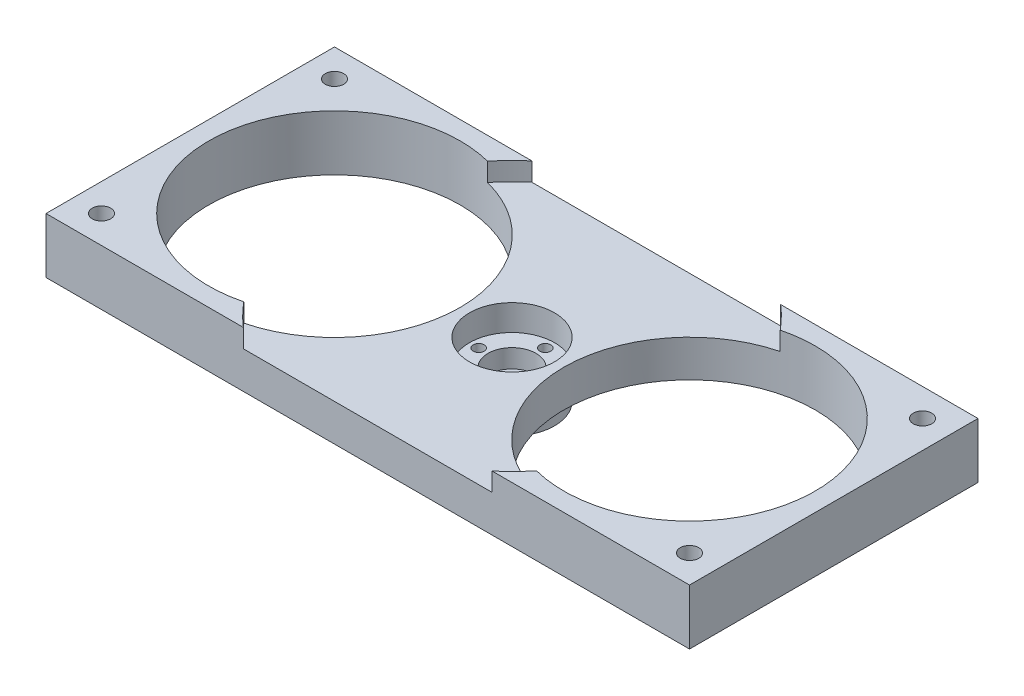
ISO-10303-21;
HEADER;
FILE_DESCRIPTION(('STEP AP214'),'2;1');
FILE_NAME('part.step','',(''),(''),'','','');
FILE_SCHEMA(('AUTOMOTIVE_DESIGN { 1 0 10303 214 1 1 1 1 }'));
ENDSEC;
DATA;
#1=APPLICATION_CONTEXT('core data for automotive mechanical design processes');
#2=APPLICATION_PROTOCOL_DEFINITION('international standard','automotive_design',2000,#1);
#3=PRODUCT_CONTEXT('',#1,'mechanical');
#4=PRODUCT('Part','Part','',(#3));
#5=PRODUCT_RELATED_PRODUCT_CATEGORY('part','',(#4));
#6=PRODUCT_DEFINITION_FORMATION('','',#4);
#7=PRODUCT_DEFINITION_CONTEXT('part definition',#1,'design');
#8=PRODUCT_DEFINITION('design','',#6,#7);
#9=PRODUCT_DEFINITION_SHAPE('','',#8);
#10=(LENGTH_UNIT() NAMED_UNIT(*) SI_UNIT(.MILLI.,.METRE.));
#11=(NAMED_UNIT(*) PLANE_ANGLE_UNIT() SI_UNIT($,.RADIAN.));
#12=(NAMED_UNIT(*) SI_UNIT($,.STERADIAN.) SOLID_ANGLE_UNIT());
#13=UNCERTAINTY_MEASURE_WITH_UNIT(LENGTH_MEASURE(1.E-05),#10,'distance_accuracy_value','');
#14=(GEOMETRIC_REPRESENTATION_CONTEXT(3) GLOBAL_UNCERTAINTY_ASSIGNED_CONTEXT((#13)) GLOBAL_UNIT_ASSIGNED_CONTEXT((#10,
#11,#12)) REPRESENTATION_CONTEXT('',''));
#15=CARTESIAN_POINT('',(0.,0.,0.));
#16=DIRECTION('',(0.,0.,1.));
#17=DIRECTION('',(1.,0.,0.));
#18=AXIS2_PLACEMENT_3D('',#15,#16,#17);
#19=CARTESIAN_POINT('',(0.,0.,0.));
#20=DIRECTION('',(0.,1.,0.));
#21=DIRECTION('',(0.,0.,1.));
#22=AXIS2_PLACEMENT_3D('',#19,#20,#21);
#23=PLANE('',#22);
#24=CARTESIAN_POINT('',(0.,0.,-9.));
#25=DIRECTION('',(0.,1.,0.));
#26=DIRECTION('',(0.,0.,1.));
#27=AXIS2_PLACEMENT_3D('',#24,#25,#26);
#28=CIRCLE('',#27,1.5);
#29=CARTESIAN_POINT('',(0.,0.,-7.5));
#30=VERTEX_POINT('',#29);
#31=EDGE_CURVE('E250',#30,#30,#28,.T.);
#32=ORIENTED_EDGE('',*,*,#31,.T.);
#33=EDGE_LOOP('',(#32));
#34=FACE_BOUND('',#33,.T.);
#35=CARTESIAN_POINT('',(-9.,0.,0.));
#36=DIRECTION('',(0.,1.,0.));
#37=DIRECTION('',(0.,0.,1.));
#38=AXIS2_PLACEMENT_3D('',#35,#36,#37);
#39=CIRCLE('',#38,1.5);
#40=CARTESIAN_POINT('',(-9.,0.,1.5));
#41=VERTEX_POINT('',#40);
#42=EDGE_CURVE('E254',#41,#41,#39,.T.);
#43=ORIENTED_EDGE('',*,*,#42,.T.);
#44=EDGE_LOOP('',(#43));
#45=FACE_BOUND('',#44,.T.);
#46=CARTESIAN_POINT('',(0.,0.,9.));
#47=DIRECTION('',(0.,1.,0.));
#48=DIRECTION('',(0.,0.,1.));
#49=AXIS2_PLACEMENT_3D('',#46,#47,#48);
#50=CIRCLE('',#49,1.5);
#51=CARTESIAN_POINT('',(0.,0.,10.5));
#52=VERTEX_POINT('',#51);
#53=EDGE_CURVE('E260',#52,#52,#50,.T.);
#54=ORIENTED_EDGE('',*,*,#53,.T.);
#55=EDGE_LOOP('',(#54));
#56=FACE_BOUND('',#55,.T.);
#57=CARTESIAN_POINT('',(9.,0.,0.));
#58=DIRECTION('',(0.,1.,0.));
#59=DIRECTION('',(0.,0.,1.));
#60=AXIS2_PLACEMENT_3D('',#57,#58,#59);
#61=CIRCLE('',#60,1.5);
#62=CARTESIAN_POINT('',(9.,0.,1.5));
#63=VERTEX_POINT('',#62);
#64=EDGE_CURVE('E271',#63,#63,#61,.T.);
#65=ORIENTED_EDGE('',*,*,#64,.T.);
#66=EDGE_LOOP('',(#65));
#67=FACE_BOUND('',#66,.T.);
#68=CARTESIAN_POINT('',(0.,0.,0.));
#69=DIRECTION('',(0.,1.,0.));
#70=DIRECTION('',(0.,0.,1.));
#71=AXIS2_PLACEMENT_3D('',#68,#69,#70);
#72=CIRCLE('',#71,2.5);
#73=CARTESIAN_POINT('',(0.,0.,2.5));
#74=VERTEX_POINT('',#73);
#75=EDGE_CURVE('E74',#74,#74,#72,.T.);
#76=ORIENTED_EDGE('',*,*,#75,.T.);
#77=EDGE_LOOP('',(#76));
#78=FACE_BOUND('',#77,.T.);
#79=CARTESIAN_POINT('',(0.,0.,0.));
#80=DIRECTION('',(0.,-1.,0.));
#81=DIRECTION('',(0.,0.,-1.));
#82=AXIS2_PLACEMENT_3D('',#79,#80,#81);
#83=CIRCLE('',#82,11.5);
#84=CARTESIAN_POINT('',(0.,0.,-11.5));
#85=VERTEX_POINT('',#84);
#86=EDGE_CURVE('E402',#85,#85,#83,.T.);
#87=ORIENTED_EDGE('',*,*,#86,.T.);
#88=EDGE_LOOP('',(#87));
#89=FACE_BOUND('',#88,.T.);
#90=ADVANCED_FACE('F65',(#34,#45,#56,#67,#78,#89),#23,.F.);
#91=CARTESIAN_POINT('',(0.,15.,39.));
#92=DIRECTION('',(0.,0.,1.));
#93=DIRECTION('',(1.,0.,0.));
#94=AXIS2_PLACEMENT_3D('',#91,#92,#93);
#95=PLANE('',#94);
#96=DIRECTION('',(0.,-1.,0.));
#97=VECTOR('',#96,1.);
#98=CARTESIAN_POINT('',(-87.,20.,39.));
#99=LINE('',#98,#97);
#100=CARTESIAN_POINT('',(-87.,20.,39.));
#101=VERTEX_POINT('',#100);
#102=CARTESIAN_POINT('',(-87.,5.,39.));
#103=VERTEX_POINT('',#102);
#104=EDGE_CURVE('E171',#101,#103,#99,.T.);
#105=ORIENTED_EDGE('',*,*,#104,.T.);
#106=DIRECTION('',(-1.,0.,0.));
#107=VECTOR('',#106,1.);
#108=CARTESIAN_POINT('',(87.,5.,39.));
#109=LINE('',#108,#107);
#110=CARTESIAN_POINT('',(87.,5.,39.));
#111=VERTEX_POINT('',#110);
#112=EDGE_CURVE('E156',#111,#103,#109,.T.);
#113=ORIENTED_EDGE('',*,*,#112,.F.);
#114=DIRECTION('',(0.,-1.,0.));
#115=VECTOR('',#114,1.);
#116=CARTESIAN_POINT('',(87.,20.,39.));
#117=LINE('',#116,#115);
#118=CARTESIAN_POINT('',(87.,20.,39.));
#119=VERTEX_POINT('',#118);
#120=EDGE_CURVE('E167',#119,#111,#117,.T.);
#121=ORIENTED_EDGE('',*,*,#120,.F.);
#122=DIRECTION('',(-1.,0.,0.));
#123=VECTOR('',#122,1.);
#124=CARTESIAN_POINT('',(0.,20.,39.));
#125=LINE('',#124,#123);
#126=CARTESIAN_POINT('',(33.6340601176843,20.,39.));
#127=VERTEX_POINT('',#126);
#128=EDGE_CURVE('E432',#119,#127,#125,.T.);
#129=ORIENTED_EDGE('',*,*,#128,.T.);
#130=DIRECTION('',(0.,-1.,0.));
#131=VECTOR('',#130,1.);
#132=CARTESIAN_POINT('',(33.6340601176843,20.,39.));
#133=LINE('',#132,#131);
#134=CARTESIAN_POINT('',(33.6340601176843,15.,39.));
#135=VERTEX_POINT('',#134);
#136=EDGE_CURVE('E178',#127,#135,#133,.T.);
#137=ORIENTED_EDGE('',*,*,#136,.T.);
#138=DIRECTION('',(-1.,0.,0.));
#139=VECTOR('',#138,1.);
#140=CARTESIAN_POINT('',(0.,15.,39.));
#141=LINE('',#140,#139);
#142=CARTESIAN_POINT('',(-33.6340601176843,15.,39.));
#143=VERTEX_POINT('',#142);
#144=EDGE_CURVE('E224',#135,#143,#141,.T.);
#145=ORIENTED_EDGE('',*,*,#144,.T.);
#146=DIRECTION('',(0.,-1.,0.));
#147=VECTOR('',#146,1.);
#148=CARTESIAN_POINT('',(-33.6340601176843,20.,39.));
#149=LINE('',#148,#147);
#150=CARTESIAN_POINT('',(-33.6340601176843,20.,39.));
#151=VERTEX_POINT('',#150);
#152=EDGE_CURVE('E90',#151,#143,#149,.T.);
#153=ORIENTED_EDGE('',*,*,#152,.F.);
#154=DIRECTION('',(-1.,0.,0.));
#155=VECTOR('',#154,1.);
#156=CARTESIAN_POINT('',(0.,20.,39.));
#157=LINE('',#156,#155);
#158=EDGE_CURVE('E201',#151,#101,#157,.T.);
#159=ORIENTED_EDGE('',*,*,#158,.T.);
#160=EDGE_LOOP('',(#105,#113,#121,#129,#137,#145,#153,#159));
#161=FACE_BOUND('',#160,.T.);
#162=ADVANCED_FACE('F165',(#161),#95,.T.);
#163=CARTESIAN_POINT('',(48.,15.,0.));
#164=DIRECTION('',(0.,-1.,0.));
#165=DIRECTION('',(0.,0.,-1.));
#166=AXIS2_PLACEMENT_3D('',#163,#164,#165);
#167=CYLINDRICAL_SURFACE('',#166,34.);
#168=CARTESIAN_POINT('',(48.,15.,0.));
#169=DIRECTION('',(0.,1.,0.));
#170=DIRECTION('',(0.,0.,1.));
#171=AXIS2_PLACEMENT_3D('',#168,#169,#170);
#172=CIRCLE('',#171,34.);
#173=CARTESIAN_POINT('',(39.5859375,15.,-32.9424278438322));
#174=VERTEX_POINT('',#173);
#175=CARTESIAN_POINT('',(39.5859375,15.,32.9424278438322));
#176=VERTEX_POINT('',#175);
#177=EDGE_CURVE('E230',#174,#176,#172,.T.);
#178=ORIENTED_EDGE('',*,*,#177,.T.);
#179=DIRECTION('',(0.,-1.,0.));
#180=VECTOR('',#179,1.);
#181=CARTESIAN_POINT('',(39.5859375,20.,32.9424278438322));
#182=LINE('',#181,#180);
#183=CARTESIAN_POINT('',(39.5859375,20.,32.9424278438322));
#184=VERTEX_POINT('',#183);
#185=EDGE_CURVE('E443',#184,#176,#182,.T.);
#186=ORIENTED_EDGE('',*,*,#185,.F.);
#187=CARTESIAN_POINT('',(48.,20.,0.));
#188=DIRECTION('',(0.,1.,0.));
#189=DIRECTION('',(0.,0.,1.));
#190=AXIS2_PLACEMENT_3D('',#187,#188,#189);
#191=CIRCLE('',#190,34.);
#192=CARTESIAN_POINT('',(39.5859375,20.,-32.9424278438322));
#193=VERTEX_POINT('',#192);
#194=EDGE_CURVE('E440',#184,#193,#191,.T.);
#195=ORIENTED_EDGE('',*,*,#194,.T.);
#196=DIRECTION('',(0.,-1.,0.));
#197=VECTOR('',#196,1.);
#198=CARTESIAN_POINT('',(39.5859375,20.,-32.9424278438322));
#199=LINE('',#198,#197);
#200=EDGE_CURVE('E445',#193,#174,#199,.T.);
#201=ORIENTED_EDGE('',*,*,#200,.T.);
#202=EDGE_LOOP('',(#178,#186,#195,#201));
#203=FACE_BOUND('',#202,.T.);
#204=CARTESIAN_POINT('',(48.,5.,0.));
#205=DIRECTION('',(0.,-1.,0.));
#206=DIRECTION('',(0.,0.,-1.));
#207=AXIS2_PLACEMENT_3D('',#204,#205,#206);
#208=CIRCLE('',#207,34.);
#209=CARTESIAN_POINT('',(48.,5.,-34.));
#210=VERTEX_POINT('',#209);
#211=EDGE_CURVE('E420',#210,#210,#208,.T.);
#212=ORIENTED_EDGE('',*,*,#211,.T.);
#213=EDGE_LOOP('',(#212));
#214=FACE_BOUND('',#213,.T.);
#215=ADVANCED_FACE('F303',(#203,#214),#167,.F.);
#216=CARTESIAN_POINT('',(0.,15.,-39.));
#217=DIRECTION('',(0.,0.,1.));
#218=DIRECTION('',(1.,0.,0.));
#219=AXIS2_PLACEMENT_3D('',#216,#217,#218);
#220=PLANE('',#219);
#221=DIRECTION('',(1.,0.,0.));
#222=VECTOR('',#221,1.);
#223=CARTESIAN_POINT('',(-87.,5.,-39.));
#224=LINE('',#223,#222);
#225=CARTESIAN_POINT('',(-87.,5.,-39.));
#226=VERTEX_POINT('',#225);
#227=CARTESIAN_POINT('',(87.,5.,-39.));
#228=VERTEX_POINT('',#227);
#229=EDGE_CURVE('E82',#226,#228,#224,.T.);
#230=ORIENTED_EDGE('',*,*,#229,.F.);
#231=DIRECTION('',(0.,-1.,0.));
#232=VECTOR('',#231,1.);
#233=CARTESIAN_POINT('',(-87.,20.,-39.));
#234=LINE('',#233,#232);
#235=CARTESIAN_POINT('',(-87.,20.,-39.));
#236=VERTEX_POINT('',#235);
#237=EDGE_CURVE('E215',#236,#226,#234,.T.);
#238=ORIENTED_EDGE('',*,*,#237,.F.);
#239=DIRECTION('',(-1.,0.,0.));
#240=VECTOR('',#239,1.);
#241=CARTESIAN_POINT('',(0.,20.,-39.));
#242=LINE('',#241,#240);
#243=CARTESIAN_POINT('',(-33.6340601176843,20.,-39.));
#244=VERTEX_POINT('',#243);
#245=EDGE_CURVE('E196',#244,#236,#242,.T.);
#246=ORIENTED_EDGE('',*,*,#245,.F.);
#247=DIRECTION('',(0.,-1.,0.));
#248=VECTOR('',#247,1.);
#249=CARTESIAN_POINT('',(-33.6340601176843,20.,-39.));
#250=LINE('',#249,#248);
#251=CARTESIAN_POINT('',(-33.6340601176843,15.,-39.));
#252=VERTEX_POINT('',#251);
#253=EDGE_CURVE('E218',#244,#252,#250,.T.);
#254=ORIENTED_EDGE('',*,*,#253,.T.);
#255=DIRECTION('',(-1.,0.,0.));
#256=VECTOR('',#255,1.);
#257=CARTESIAN_POINT('',(0.,15.,-39.));
#258=LINE('',#257,#256);
#259=CARTESIAN_POINT('',(33.6340601176843,15.,-39.));
#260=VERTEX_POINT('',#259);
#261=EDGE_CURVE('E236',#260,#252,#258,.T.);
#262=ORIENTED_EDGE('',*,*,#261,.F.);
#263=DIRECTION('',(0.,-1.,0.));
#264=VECTOR('',#263,1.);
#265=CARTESIAN_POINT('',(33.6340601176843,20.,-39.));
#266=LINE('',#265,#264);
#267=CARTESIAN_POINT('',(33.6340601176843,20.,-39.));
#268=VERTEX_POINT('',#267);
#269=EDGE_CURVE('E184',#268,#260,#266,.T.);
#270=ORIENTED_EDGE('',*,*,#269,.F.);
#271=DIRECTION('',(-1.,0.,0.));
#272=VECTOR('',#271,1.);
#273=CARTESIAN_POINT('',(0.,20.,-39.));
#274=LINE('',#273,#272);
#275=CARTESIAN_POINT('',(87.,20.,-39.));
#276=VERTEX_POINT('',#275);
#277=EDGE_CURVE('E435',#276,#268,#274,.T.);
#278=ORIENTED_EDGE('',*,*,#277,.F.);
#279=DIRECTION('',(0.,-1.,0.));
#280=VECTOR('',#279,1.);
#281=CARTESIAN_POINT('',(87.,20.,-39.));
#282=LINE('',#281,#280);
#283=EDGE_CURVE('E179',#276,#228,#282,.T.);
#284=ORIENTED_EDGE('',*,*,#283,.T.);
#285=EDGE_LOOP('',(#230,#238,#246,#254,#262,#270,#278,#284));
#286=FACE_BOUND('',#285,.T.);
#287=ADVANCED_FACE('F337',(#286),#220,.F.);
#288=CARTESIAN_POINT('',(-48.,15.,0.));
#289=DIRECTION('',(0.,-1.,0.));
#290=DIRECTION('',(0.,0.,-1.));
#291=AXIS2_PLACEMENT_3D('',#288,#289,#290);
#292=CYLINDRICAL_SURFACE('',#291,34.);
#293=CARTESIAN_POINT('',(-48.,15.,0.));
#294=DIRECTION('',(0.,1.,0.));
#295=DIRECTION('',(0.,0.,1.));
#296=AXIS2_PLACEMENT_3D('',#293,#294,#295);
#297=CIRCLE('',#296,34.);
#298=CARTESIAN_POINT('',(-39.5859375,15.,32.9424278438322));
#299=VERTEX_POINT('',#298);
#300=CARTESIAN_POINT('',(-39.5859375,15.,-32.9424278438322));
#301=VERTEX_POINT('',#300);
#302=EDGE_CURVE('E242',#299,#301,#297,.T.);
#303=ORIENTED_EDGE('',*,*,#302,.T.);
#304=DIRECTION('',(0.,-1.,0.));
#305=VECTOR('',#304,1.);
#306=CARTESIAN_POINT('',(-39.5859375,20.,-32.9424278438322));
#307=LINE('',#306,#305);
#308=CARTESIAN_POINT('',(-39.5859375,20.,-32.9424278438322));
#309=VERTEX_POINT('',#308);
#310=EDGE_CURVE('E208',#309,#301,#307,.T.);
#311=ORIENTED_EDGE('',*,*,#310,.F.);
#312=CARTESIAN_POINT('',(-48.,20.,0.));
#313=DIRECTION('',(0.,1.,0.));
#314=DIRECTION('',(0.,0.,1.));
#315=AXIS2_PLACEMENT_3D('',#312,#313,#314);
#316=CIRCLE('',#315,34.);
#317=CARTESIAN_POINT('',(-39.5859375,20.,32.9424278438322));
#318=VERTEX_POINT('',#317);
#319=EDGE_CURVE('E205',#309,#318,#316,.T.);
#320=ORIENTED_EDGE('',*,*,#319,.T.);
#321=DIRECTION('',(0.,-1.,0.));
#322=VECTOR('',#321,1.);
#323=CARTESIAN_POINT('',(-39.5859375,20.,32.9424278438322));
#324=LINE('',#323,#322);
#325=EDGE_CURVE('E210',#318,#299,#324,.T.);
#326=ORIENTED_EDGE('',*,*,#325,.T.);
#327=EDGE_LOOP('',(#303,#311,#320,#326));
#328=FACE_BOUND('',#327,.T.);
#329=CARTESIAN_POINT('',(-48.,5.,0.));
#330=DIRECTION('',(0.,-1.,0.));
#331=DIRECTION('',(0.,0.,-1.));
#332=AXIS2_PLACEMENT_3D('',#329,#330,#331);
#333=CIRCLE('',#332,34.);
#334=CARTESIAN_POINT('',(-48.,5.,-34.));
#335=VERTEX_POINT('',#334);
#336=EDGE_CURVE('E417',#335,#335,#333,.T.);
#337=ORIENTED_EDGE('',*,*,#336,.T.);
#338=EDGE_LOOP('',(#337));
#339=FACE_BOUND('',#338,.T.);
#340=ADVANCED_FACE('F341',(#328,#339),#292,.F.);
#341=CARTESIAN_POINT('',(-87.,20.,0.));
#342=DIRECTION('',(1.,0.,0.));
#343=DIRECTION('',(0.,0.,-1.));
#344=AXIS2_PLACEMENT_3D('',#341,#342,#343);
#345=PLANE('',#344);
#346=DIRECTION('',(0.,0.,-1.));
#347=VECTOR('',#346,1.);
#348=CARTESIAN_POINT('',(-87.,5.,39.));
#349=LINE('',#348,#347);
#350=EDGE_CURVE('E172',#103,#226,#349,.T.);
#351=ORIENTED_EDGE('',*,*,#350,.F.);
#352=ORIENTED_EDGE('',*,*,#104,.F.);
#353=DIRECTION('',(0.,0.,1.));
#354=VECTOR('',#353,1.);
#355=CARTESIAN_POINT('',(-87.,20.,0.));
#356=LINE('',#355,#354);
#357=EDGE_CURVE('E199',#236,#101,#356,.T.);
#358=ORIENTED_EDGE('',*,*,#357,.F.);
#359=ORIENTED_EDGE('',*,*,#237,.T.);
#360=EDGE_LOOP('',(#351,#352,#358,#359));
#361=FACE_BOUND('',#360,.T.);
#362=ADVANCED_FACE('F345',(#361),#345,.F.);
#363=CARTESIAN_POINT('',(-79.5,20.,31.5));
#364=DIRECTION('',(0.,-1.,0.));
#365=DIRECTION('',(0.,0.,-1.));
#366=AXIS2_PLACEMENT_3D('',#363,#364,#365);
#367=CYLINDRICAL_SURFACE('',#366,2.5);
#368=CARTESIAN_POINT('',(-79.5,20.,31.5));
#369=DIRECTION('',(0.,1.,0.));
#370=DIRECTION('',(0.,0.,1.));
#371=AXIS2_PLACEMENT_3D('',#368,#369,#370);
#372=CIRCLE('',#371,2.5);
#373=CARTESIAN_POINT('',(-79.5,20.,34.));
#374=VERTEX_POINT('',#373);
#375=EDGE_CURVE('E190',#374,#374,#372,.T.);
#376=ORIENTED_EDGE('',*,*,#375,.T.);
#377=EDGE_LOOP('',(#376));
#378=FACE_BOUND('',#377,.T.);
#379=CARTESIAN_POINT('',(-79.5,5.,31.5));
#380=DIRECTION('',(0.,-1.,0.));
#381=DIRECTION('',(0.,0.,-1.));
#382=AXIS2_PLACEMENT_3D('',#379,#380,#381);
#383=CIRCLE('',#382,2.5);
#384=CARTESIAN_POINT('',(-79.5,5.,29.));
#385=VERTEX_POINT('',#384);
#386=EDGE_CURVE('E414',#385,#385,#383,.T.);
#387=ORIENTED_EDGE('',*,*,#386,.T.);
#388=EDGE_LOOP('',(#387));
#389=FACE_BOUND('',#388,.T.);
#390=ADVANCED_FACE('F354',(#378,#389),#367,.F.);
#391=CARTESIAN_POINT('',(-79.5,20.,-31.5));
#392=DIRECTION('',(0.,-1.,0.));
#393=DIRECTION('',(0.,0.,-1.));
#394=AXIS2_PLACEMENT_3D('',#391,#392,#393);
#395=CYLINDRICAL_SURFACE('',#394,2.5);
#396=CARTESIAN_POINT('',(-79.5,20.,-31.5));
#397=DIRECTION('',(0.,1.,0.));
#398=DIRECTION('',(0.,0.,1.));
#399=AXIS2_PLACEMENT_3D('',#396,#397,#398);
#400=CIRCLE('',#399,2.5);
#401=CARTESIAN_POINT('',(-79.5,20.,-29.));
#402=VERTEX_POINT('',#401);
#403=EDGE_CURVE('E182',#402,#402,#400,.T.);
#404=ORIENTED_EDGE('',*,*,#403,.T.);
#405=EDGE_LOOP('',(#404));
#406=FACE_BOUND('',#405,.T.);
#407=CARTESIAN_POINT('',(-79.5,5.,-31.5));
#408=DIRECTION('',(0.,-1.,0.));
#409=DIRECTION('',(0.,0.,-1.));
#410=AXIS2_PLACEMENT_3D('',#407,#408,#409);
#411=CIRCLE('',#410,2.5);
#412=CARTESIAN_POINT('',(-79.5,5.,-34.));
#413=VERTEX_POINT('',#412);
#414=EDGE_CURVE('E411',#413,#413,#411,.T.);
#415=ORIENTED_EDGE('',*,*,#414,.T.);
#416=EDGE_LOOP('',(#415));
#417=FACE_BOUND('',#416,.T.);
#418=ADVANCED_FACE('F351',(#406,#417),#395,.F.);
#419=CARTESIAN_POINT('',(87.,20.,0.));
#420=DIRECTION('',(1.,0.,0.));
#421=DIRECTION('',(0.,0.,-1.));
#422=AXIS2_PLACEMENT_3D('',#419,#420,#421);
#423=PLANE('',#422);
#424=ORIENTED_EDGE('',*,*,#120,.T.);
#425=DIRECTION('',(0.,0.,1.));
#426=VECTOR('',#425,1.);
#427=CARTESIAN_POINT('',(87.,5.,-39.));
#428=LINE('',#427,#426);
#429=EDGE_CURVE('E153',#228,#111,#428,.T.);
#430=ORIENTED_EDGE('',*,*,#429,.F.);
#431=ORIENTED_EDGE('',*,*,#283,.F.);
#432=DIRECTION('',(0.,0.,1.));
#433=VECTOR('',#432,1.);
#434=CARTESIAN_POINT('',(87.,20.,0.));
#435=LINE('',#434,#433);
#436=EDGE_CURVE('E177',#276,#119,#435,.T.);
#437=ORIENTED_EDGE('',*,*,#436,.T.);
#438=EDGE_LOOP('',(#424,#430,#431,#437));
#439=FACE_BOUND('',#438,.T.);
#440=ADVANCED_FACE('F175',(#439),#423,.T.);
#441=CARTESIAN_POINT('',(79.5,20.,-31.5));
#442=DIRECTION('',(0.,-1.,0.));
#443=DIRECTION('',(0.,0.,-1.));
#444=AXIS2_PLACEMENT_3D('',#441,#442,#443);
#445=CYLINDRICAL_SURFACE('',#444,2.5);
#446=CARTESIAN_POINT('',(79.5,20.,-31.5));
#447=DIRECTION('',(0.,1.,0.));
#448=DIRECTION('',(0.,0.,1.));
#449=AXIS2_PLACEMENT_3D('',#446,#447,#448);
#450=CIRCLE('',#449,2.5);
#451=CARTESIAN_POINT('',(79.5,20.,-29.));
#452=VERTEX_POINT('',#451);
#453=EDGE_CURVE('E426',#452,#452,#450,.T.);
#454=ORIENTED_EDGE('',*,*,#453,.T.);
#455=EDGE_LOOP('',(#454));
#456=FACE_BOUND('',#455,.T.);
#457=CARTESIAN_POINT('',(79.5,5.,-31.5));
#458=DIRECTION('',(0.,-1.,0.));
#459=DIRECTION('',(0.,0.,-1.));
#460=AXIS2_PLACEMENT_3D('',#457,#458,#459);
#461=CIRCLE('',#460,2.5);
#462=CARTESIAN_POINT('',(79.5,5.,-34.));
#463=VERTEX_POINT('',#462);
#464=EDGE_CURVE('E408',#463,#463,#461,.T.);
#465=ORIENTED_EDGE('',*,*,#464,.T.);
#466=EDGE_LOOP('',(#465));
#467=FACE_BOUND('',#466,.T.);
#468=ADVANCED_FACE('F295',(#456,#467),#445,.F.);
#469=CARTESIAN_POINT('',(79.5,20.,31.5));
#470=DIRECTION('',(0.,-1.,0.));
#471=DIRECTION('',(0.,0.,-1.));
#472=AXIS2_PLACEMENT_3D('',#469,#470,#471);
#473=CYLINDRICAL_SURFACE('',#472,2.49999999999999);
#474=CARTESIAN_POINT('',(79.5,20.,31.5));
#475=DIRECTION('',(0.,1.,0.));
#476=DIRECTION('',(0.,0.,1.));
#477=AXIS2_PLACEMENT_3D('',#474,#475,#476);
#478=CIRCLE('',#477,2.49999999999999);
#479=CARTESIAN_POINT('',(79.5,20.,34.));
#480=VERTEX_POINT('',#479);
#481=EDGE_CURVE('E423',#480,#480,#478,.T.);
#482=ORIENTED_EDGE('',*,*,#481,.T.);
#483=EDGE_LOOP('',(#482));
#484=FACE_BOUND('',#483,.T.);
#485=CARTESIAN_POINT('',(79.5,5.,31.5));
#486=DIRECTION('',(0.,-1.,0.));
#487=DIRECTION('',(0.,0.,-1.));
#488=AXIS2_PLACEMENT_3D('',#485,#486,#487);
#489=CIRCLE('',#488,2.49999999999999);
#490=CARTESIAN_POINT('',(79.5,5.,29.));
#491=VERTEX_POINT('',#490);
#492=EDGE_CURVE('E69',#491,#491,#489,.T.);
#493=ORIENTED_EDGE('',*,*,#492,.T.);
#494=EDGE_LOOP('',(#493));
#495=FACE_BOUND('',#494,.T.);
#496=ADVANCED_FACE('F286',(#484,#495),#473,.F.);
#497=CARTESIAN_POINT('',(0.,3.,0.));
#498=DIRECTION('',(0.,-1.,0.));
#499=DIRECTION('',(0.,0.,-1.));
#500=AXIS2_PLACEMENT_3D('',#497,#498,#499);
#501=CYLINDRICAL_SURFACE('',#500,2.5);
#502=CARTESIAN_POINT('',(0.,3.,0.));
#503=DIRECTION('',(0.,1.,0.));
#504=DIRECTION('',(0.,0.,1.));
#505=AXIS2_PLACEMENT_3D('',#502,#503,#504);
#506=CIRCLE('',#505,2.5);
#507=CARTESIAN_POINT('',(0.,3.,2.5));
#508=VERTEX_POINT('',#507);
#509=EDGE_CURVE('E12',#508,#508,#506,.T.);
#510=ORIENTED_EDGE('',*,*,#509,.T.);
#511=EDGE_LOOP('',(#510));
#512=FACE_BOUND('',#511,.T.);
#513=ORIENTED_EDGE('',*,*,#75,.F.);
#514=EDGE_LOOP('',(#513));
#515=FACE_BOUND('',#514,.T.);
#516=ADVANCED_FACE('F67',(#512,#515),#501,.F.);
#517=CARTESIAN_POINT('',(0.,3.,0.));
#518=DIRECTION('',(0.,1.,0.));
#519=DIRECTION('',(0.,0.,1.));
#520=AXIS2_PLACEMENT_3D('',#517,#518,#519);
#521=PLANE('',#520);
#522=ORIENTED_EDGE('',*,*,#509,.F.);
#523=EDGE_LOOP('',(#522));
#524=FACE_BOUND('',#523,.T.);
#525=CARTESIAN_POINT('',(0.,3.,0.));
#526=DIRECTION('',(0.,1.,0.));
#527=DIRECTION('',(0.,0.,1.));
#528=AXIS2_PLACEMENT_3D('',#525,#526,#527);
#529=CIRCLE('',#528,6.5);
#530=CARTESIAN_POINT('',(0.,3.,6.5));
#531=VERTEX_POINT('',#530);
#532=EDGE_CURVE('E275',#531,#531,#529,.F.);
#533=ORIENTED_EDGE('',*,*,#532,.F.);
#534=EDGE_LOOP('',(#533));
#535=FACE_BOUND('',#534,.T.);
#536=ADVANCED_FACE('F285',(#524,#535),#521,.T.);
#537=CARTESIAN_POINT('',(0.,8.,0.));
#538=DIRECTION('',(0.,1.,0.));
#539=DIRECTION('',(0.,0.,1.));
#540=AXIS2_PLACEMENT_3D('',#537,#538,#539);
#541=PLANE('',#540);
#542=CARTESIAN_POINT('',(-9.,8.,0.));
#543=DIRECTION('',(0.,1.,0.));
#544=DIRECTION('',(0.,0.,1.));
#545=AXIS2_PLACEMENT_3D('',#542,#543,#544);
#546=CIRCLE('',#545,1.5);
#547=CARTESIAN_POINT('',(-9.,8.,1.5));
#548=VERTEX_POINT('',#547);
#549=EDGE_CURVE('E257',#548,#548,#546,.T.);
#550=ORIENTED_EDGE('',*,*,#549,.F.);
#551=EDGE_LOOP('',(#550));
#552=FACE_BOUND('',#551,.T.);
#553=CARTESIAN_POINT('',(0.,8.,0.));
#554=DIRECTION('',(0.,1.,0.));
#555=DIRECTION('',(0.,0.,1.));
#556=AXIS2_PLACEMENT_3D('',#553,#554,#555);
#557=CIRCLE('',#556,6.5);
#558=CARTESIAN_POINT('',(0.,8.,6.5));
#559=VERTEX_POINT('',#558);
#560=EDGE_CURVE('E266',#559,#559,#557,.T.);
#561=ORIENTED_EDGE('',*,*,#560,.F.);
#562=EDGE_LOOP('',(#561));
#563=FACE_BOUND('',#562,.T.);
#564=CARTESIAN_POINT('',(0.,8.,0.));
#565=DIRECTION('',(0.,1.,0.));
#566=DIRECTION('',(0.,0.,1.));
#567=AXIS2_PLACEMENT_3D('',#564,#565,#566);
#568=CIRCLE('',#567,11.5);
#569=CARTESIAN_POINT('',(0.,8.,11.5));
#570=VERTEX_POINT('',#569);
#571=EDGE_CURVE('E247',#570,#570,#568,.F.);
#572=ORIENTED_EDGE('',*,*,#571,.F.);
#573=EDGE_LOOP('',(#572));
#574=FACE_BOUND('',#573,.T.);
#575=CARTESIAN_POINT('',(9.,8.,0.));
#576=DIRECTION('',(0.,1.,0.));
#577=DIRECTION('',(0.,0.,1.));
#578=AXIS2_PLACEMENT_3D('',#575,#576,#577);
#579=CIRCLE('',#578,1.5);
#580=CARTESIAN_POINT('',(9.,8.,1.5));
#581=VERTEX_POINT('',#580);
#582=EDGE_CURVE('E272',#581,#581,#579,.T.);
#583=ORIENTED_EDGE('',*,*,#582,.F.);
#584=EDGE_LOOP('',(#583));
#585=FACE_BOUND('',#584,.T.);
#586=CARTESIAN_POINT('',(0.,8.,9.));
#587=DIRECTION('',(0.,1.,0.));
#588=DIRECTION('',(0.,0.,1.));
#589=AXIS2_PLACEMENT_3D('',#586,#587,#588);
#590=CIRCLE('',#589,1.5);
#591=CARTESIAN_POINT('',(0.,8.,10.5));
#592=VERTEX_POINT('',#591);
#593=EDGE_CURVE('E263',#592,#592,#590,.T.);
#594=ORIENTED_EDGE('',*,*,#593,.F.);
#595=EDGE_LOOP('',(#594));
#596=FACE_BOUND('',#595,.T.);
#597=CARTESIAN_POINT('',(0.,8.,-9.));
#598=DIRECTION('',(0.,1.,0.));
#599=DIRECTION('',(0.,0.,1.));
#600=AXIS2_PLACEMENT_3D('',#597,#598,#599);
#601=CIRCLE('',#600,1.5);
#602=CARTESIAN_POINT('',(0.,8.,-7.5));
#603=VERTEX_POINT('',#602);
#604=EDGE_CURVE('E251',#603,#603,#601,.T.);
#605=ORIENTED_EDGE('',*,*,#604,.F.);
#606=EDGE_LOOP('',(#605));
#607=FACE_BOUND('',#606,.T.);
#608=ADVANCED_FACE('F292',(#552,#563,#574,#585,#596,#607),#541,.T.);
#609=CARTESIAN_POINT('',(9.,8.,0.));
#610=DIRECTION('',(0.,-1.,0.));
#611=DIRECTION('',(0.,0.,-1.));
#612=AXIS2_PLACEMENT_3D('',#609,#610,#611);
#613=CYLINDRICAL_SURFACE('',#612,1.5);
#614=ORIENTED_EDGE('',*,*,#582,.T.);
#615=EDGE_LOOP('',(#614));
#616=FACE_BOUND('',#615,.T.);
#617=ORIENTED_EDGE('',*,*,#64,.F.);
#618=EDGE_LOOP('',(#617));
#619=FACE_BOUND('',#618,.T.);
#620=ADVANCED_FACE('F309',(#616,#619),#613,.F.);
#621=CARTESIAN_POINT('',(0.,8.,0.));
#622=DIRECTION('',(0.,-1.,0.));
#623=DIRECTION('',(0.,0.,-1.));
#624=AXIS2_PLACEMENT_3D('',#621,#622,#623);
#625=CYLINDRICAL_SURFACE('',#624,6.5);
#626=ORIENTED_EDGE('',*,*,#532,.T.);
#627=EDGE_LOOP('',(#626));
#628=FACE_BOUND('',#627,.T.);
#629=ORIENTED_EDGE('',*,*,#560,.T.);
#630=EDGE_LOOP('',(#629));
#631=FACE_BOUND('',#630,.T.);
#632=ADVANCED_FACE('F313',(#628,#631),#625,.F.);
#633=CARTESIAN_POINT('',(0.,8.,9.));
#634=DIRECTION('',(0.,-1.,0.));
#635=DIRECTION('',(0.,0.,-1.));
#636=AXIS2_PLACEMENT_3D('',#633,#634,#635);
#637=CYLINDRICAL_SURFACE('',#636,1.5);
#638=ORIENTED_EDGE('',*,*,#593,.T.);
#639=EDGE_LOOP('',(#638));
#640=FACE_BOUND('',#639,.T.);
#641=ORIENTED_EDGE('',*,*,#53,.F.);
#642=EDGE_LOOP('',(#641));
#643=FACE_BOUND('',#642,.T.);
#644=ADVANCED_FACE('F317',(#640,#643),#637,.F.);
#645=CARTESIAN_POINT('',(-9.,8.,0.));
#646=DIRECTION('',(0.,-1.,0.));
#647=DIRECTION('',(0.,0.,-1.));
#648=AXIS2_PLACEMENT_3D('',#645,#646,#647);
#649=CYLINDRICAL_SURFACE('',#648,1.5);
#650=ORIENTED_EDGE('',*,*,#549,.T.);
#651=EDGE_LOOP('',(#650));
#652=FACE_BOUND('',#651,.T.);
#653=ORIENTED_EDGE('',*,*,#42,.F.);
#654=EDGE_LOOP('',(#653));
#655=FACE_BOUND('',#654,.T.);
#656=ADVANCED_FACE('F321',(#652,#655),#649,.F.);
#657=CARTESIAN_POINT('',(0.,8.,-9.));
#658=DIRECTION('',(0.,-1.,0.));
#659=DIRECTION('',(0.,0.,-1.));
#660=AXIS2_PLACEMENT_3D('',#657,#658,#659);
#661=CYLINDRICAL_SURFACE('',#660,1.5);
#662=ORIENTED_EDGE('',*,*,#604,.T.);
#663=EDGE_LOOP('',(#662));
#664=FACE_BOUND('',#663,.T.);
#665=ORIENTED_EDGE('',*,*,#31,.F.);
#666=EDGE_LOOP('',(#665));
#667=FACE_BOUND('',#666,.T.);
#668=ADVANCED_FACE('F325',(#664,#667),#661,.F.);
#669=CARTESIAN_POINT('',(0.,15.,0.));
#670=DIRECTION('',(0.,-1.,0.));
#671=DIRECTION('',(0.,0.,-1.));
#672=AXIS2_PLACEMENT_3D('',#669,#670,#671);
#673=CYLINDRICAL_SURFACE('',#672,11.5);
#674=ORIENTED_EDGE('',*,*,#571,.T.);
#675=EDGE_LOOP('',(#674));
#676=FACE_BOUND('',#675,.T.);
#677=CARTESIAN_POINT('',(0.,15.,0.));
#678=DIRECTION('',(0.,1.,0.));
#679=DIRECTION('',(0.,0.,1.));
#680=AXIS2_PLACEMENT_3D('',#677,#678,#679);
#681=CIRCLE('',#680,11.5);
#682=CARTESIAN_POINT('',(0.,15.,11.5));
#683=VERTEX_POINT('',#682);
#684=EDGE_CURVE('E221',#683,#683,#681,.T.);
#685=ORIENTED_EDGE('',*,*,#684,.T.);
#686=EDGE_LOOP('',(#685));
#687=FACE_BOUND('',#686,.T.);
#688=ADVANCED_FACE('F329',(#676,#687),#673,.F.);
#689=CARTESIAN_POINT('',(0.,15.,0.));
#690=DIRECTION('',(0.,1.,0.));
#691=DIRECTION('',(0.,0.,1.));
#692=AXIS2_PLACEMENT_3D('',#689,#690,#691);
#693=PLANE('',#692);
#694=ORIENTED_EDGE('',*,*,#684,.F.);
#695=EDGE_LOOP('',(#694));
#696=FACE_BOUND('',#695,.T.);
#697=ORIENTED_EDGE('',*,*,#144,.F.);
#698=CARTESIAN_POINT('',(0.,15.,0.));
#699=DIRECTION('',(0.,1.,0.));
#700=DIRECTION('',(0.,0.,1.));
#701=AXIS2_PLACEMENT_3D('',#698,#699,#700);
#702=CIRCLE('',#701,51.5);
#703=EDGE_CURVE('E227',#135,#176,#702,.T.);
#704=ORIENTED_EDGE('',*,*,#703,.T.);
#705=ORIENTED_EDGE('',*,*,#177,.F.);
#706=CARTESIAN_POINT('',(0.,15.,0.));
#707=DIRECTION('',(0.,1.,0.));
#708=DIRECTION('',(0.,0.,1.));
#709=AXIS2_PLACEMENT_3D('',#706,#707,#708);
#710=CIRCLE('',#709,51.5);
#711=EDGE_CURVE('E233',#174,#260,#710,.T.);
#712=ORIENTED_EDGE('',*,*,#711,.T.);
#713=ORIENTED_EDGE('',*,*,#261,.T.);
#714=CARTESIAN_POINT('',(0.,15.,0.));
#715=DIRECTION('',(0.,1.,0.));
#716=DIRECTION('',(0.,0.,1.));
#717=AXIS2_PLACEMENT_3D('',#714,#715,#716);
#718=CIRCLE('',#717,51.5);
#719=EDGE_CURVE('E239',#252,#301,#718,.T.);
#720=ORIENTED_EDGE('',*,*,#719,.T.);
#721=ORIENTED_EDGE('',*,*,#302,.F.);
#722=CARTESIAN_POINT('',(0.,15.,0.));
#723=DIRECTION('',(0.,1.,0.));
#724=DIRECTION('',(0.,0.,1.));
#725=AXIS2_PLACEMENT_3D('',#722,#723,#724);
#726=CIRCLE('',#725,51.5);
#727=EDGE_CURVE('E245',#299,#143,#726,.T.);
#728=ORIENTED_EDGE('',*,*,#727,.T.);
#729=EDGE_LOOP('',(#697,#704,#705,#712,#713,#720,#721,#728));
#730=FACE_BOUND('',#729,.T.);
#731=ADVANCED_FACE('F332',(#696,#730),#693,.T.);
#732=CARTESIAN_POINT('',(0.,20.,0.));
#733=DIRECTION('',(0.,-1.,0.));
#734=DIRECTION('',(0.,0.,-1.));
#735=AXIS2_PLACEMENT_3D('',#732,#733,#734);
#736=CYLINDRICAL_SURFACE('',#735,51.5);
#737=ORIENTED_EDGE('',*,*,#310,.T.);
#738=ORIENTED_EDGE('',*,*,#719,.F.);
#739=ORIENTED_EDGE('',*,*,#253,.F.);
#740=CARTESIAN_POINT('',(0.,20.,0.));
#741=DIRECTION('',(0.,1.,0.));
#742=DIRECTION('',(0.,0.,1.));
#743=AXIS2_PLACEMENT_3D('',#740,#741,#742);
#744=CIRCLE('',#743,51.5);
#745=EDGE_CURVE('E193',#244,#309,#744,.T.);
#746=ORIENTED_EDGE('',*,*,#745,.T.);
#747=EDGE_LOOP('',(#737,#738,#739,#746));
#748=FACE_BOUND('',#747,.T.);
#749=ADVANCED_FACE('F349',(#748),#736,.F.);
#750=CARTESIAN_POINT('',(0.,20.,0.));
#751=DIRECTION('',(0.,-1.,0.));
#752=DIRECTION('',(0.,0.,-1.));
#753=AXIS2_PLACEMENT_3D('',#750,#751,#752);
#754=CYLINDRICAL_SURFACE('',#753,51.5);
#755=ORIENTED_EDGE('',*,*,#152,.T.);
#756=ORIENTED_EDGE('',*,*,#727,.F.);
#757=ORIENTED_EDGE('',*,*,#325,.F.);
#758=CARTESIAN_POINT('',(0.,20.,0.));
#759=DIRECTION('',(0.,1.,0.));
#760=DIRECTION('',(0.,0.,1.));
#761=AXIS2_PLACEMENT_3D('',#758,#759,#760);
#762=CIRCLE('',#761,51.5);
#763=EDGE_CURVE('E203',#318,#151,#762,.T.);
#764=ORIENTED_EDGE('',*,*,#763,.T.);
#765=EDGE_LOOP('',(#755,#756,#757,#764));
#766=FACE_BOUND('',#765,.T.);
#767=ADVANCED_FACE('F361',(#766),#754,.F.);
#768=CARTESIAN_POINT('',(0.,20.,0.));
#769=DIRECTION('',(0.,1.,0.));
#770=DIRECTION('',(0.,0.,1.));
#771=AXIS2_PLACEMENT_3D('',#768,#769,#770);
#772=PLANE('',#771);
#773=ORIENTED_EDGE('',*,*,#403,.F.);
#774=EDGE_LOOP('',(#773));
#775=FACE_BOUND('',#774,.T.);
#776=ORIENTED_EDGE('',*,*,#375,.F.);
#777=EDGE_LOOP('',(#776));
#778=FACE_BOUND('',#777,.T.);
#779=ORIENTED_EDGE('',*,*,#745,.F.);
#780=ORIENTED_EDGE('',*,*,#245,.T.);
#781=ORIENTED_EDGE('',*,*,#357,.T.);
#782=ORIENTED_EDGE('',*,*,#158,.F.);
#783=ORIENTED_EDGE('',*,*,#763,.F.);
#784=ORIENTED_EDGE('',*,*,#319,.F.);
#785=EDGE_LOOP('',(#779,#780,#781,#782,#783,#784));
#786=FACE_BOUND('',#785,.T.);
#787=ADVANCED_FACE('F368',(#775,#778,#786),#772,.T.);
#788=CARTESIAN_POINT('',(0.,20.,0.));
#789=DIRECTION('',(0.,-1.,0.));
#790=DIRECTION('',(0.,0.,-1.));
#791=AXIS2_PLACEMENT_3D('',#788,#789,#790);
#792=CYLINDRICAL_SURFACE('',#791,51.5);
#793=ORIENTED_EDGE('',*,*,#185,.T.);
#794=ORIENTED_EDGE('',*,*,#703,.F.);
#795=ORIENTED_EDGE('',*,*,#136,.F.);
#796=CARTESIAN_POINT('',(0.,20.,0.));
#797=DIRECTION('',(0.,1.,0.));
#798=DIRECTION('',(0.,0.,1.));
#799=AXIS2_PLACEMENT_3D('',#796,#797,#798);
#800=CIRCLE('',#799,51.5);
#801=EDGE_CURVE('E429',#127,#184,#800,.T.);
#802=ORIENTED_EDGE('',*,*,#801,.T.);
#803=EDGE_LOOP('',(#793,#794,#795,#802));
#804=FACE_BOUND('',#803,.T.);
#805=ADVANCED_FACE('F370',(#804),#792,.F.);
#806=CARTESIAN_POINT('',(0.,20.,0.));
#807=DIRECTION('',(0.,-1.,0.));
#808=DIRECTION('',(0.,0.,-1.));
#809=AXIS2_PLACEMENT_3D('',#806,#807,#808);
#810=CYLINDRICAL_SURFACE('',#809,51.5);
#811=ORIENTED_EDGE('',*,*,#269,.T.);
#812=ORIENTED_EDGE('',*,*,#711,.F.);
#813=ORIENTED_EDGE('',*,*,#200,.F.);
#814=CARTESIAN_POINT('',(0.,20.,0.));
#815=DIRECTION('',(0.,1.,0.));
#816=DIRECTION('',(0.,0.,1.));
#817=AXIS2_PLACEMENT_3D('',#814,#815,#816);
#818=CIRCLE('',#817,51.5);
#819=EDGE_CURVE('E437',#193,#268,#818,.T.);
#820=ORIENTED_EDGE('',*,*,#819,.T.);
#821=EDGE_LOOP('',(#811,#812,#813,#820));
#822=FACE_BOUND('',#821,.T.);
#823=ADVANCED_FACE('F378',(#822),#810,.F.);
#824=CARTESIAN_POINT('',(0.,20.,0.));
#825=DIRECTION('',(0.,1.,0.));
#826=DIRECTION('',(0.,0.,1.));
#827=AXIS2_PLACEMENT_3D('',#824,#825,#826);
#828=PLANE('',#827);
#829=ORIENTED_EDGE('',*,*,#481,.F.);
#830=EDGE_LOOP('',(#829));
#831=FACE_BOUND('',#830,.T.);
#832=ORIENTED_EDGE('',*,*,#453,.F.);
#833=EDGE_LOOP('',(#832));
#834=FACE_BOUND('',#833,.T.);
#835=ORIENTED_EDGE('',*,*,#801,.F.);
#836=ORIENTED_EDGE('',*,*,#128,.F.);
#837=ORIENTED_EDGE('',*,*,#436,.F.);
#838=ORIENTED_EDGE('',*,*,#277,.T.);
#839=ORIENTED_EDGE('',*,*,#819,.F.);
#840=ORIENTED_EDGE('',*,*,#194,.F.);
#841=EDGE_LOOP('',(#835,#836,#837,#838,#839,#840));
#842=FACE_BOUND('',#841,.T.);
#843=ADVANCED_FACE('F384',(#831,#834,#842),#828,.T.);
#844=CARTESIAN_POINT('',(0.,5.,0.));
#845=DIRECTION('',(0.,-1.,0.));
#846=DIRECTION('',(0.,0.,-1.));
#847=AXIS2_PLACEMENT_3D('',#844,#845,#846);
#848=PLANE('',#847);
#849=ORIENTED_EDGE('',*,*,#211,.F.);
#850=EDGE_LOOP('',(#849));
#851=FACE_BOUND('',#850,.T.);
#852=ORIENTED_EDGE('',*,*,#336,.F.);
#853=EDGE_LOOP('',(#852));
#854=FACE_BOUND('',#853,.T.);
#855=ORIENTED_EDGE('',*,*,#386,.F.);
#856=EDGE_LOOP('',(#855));
#857=FACE_BOUND('',#856,.T.);
#858=ORIENTED_EDGE('',*,*,#414,.F.);
#859=EDGE_LOOP('',(#858));
#860=FACE_BOUND('',#859,.T.);
#861=ORIENTED_EDGE('',*,*,#464,.F.);
#862=EDGE_LOOP('',(#861));
#863=FACE_BOUND('',#862,.T.);
#864=ORIENTED_EDGE('',*,*,#492,.F.);
#865=EDGE_LOOP('',(#864));
#866=FACE_BOUND('',#865,.T.);
#867=CARTESIAN_POINT('',(0.,5.,0.));
#868=DIRECTION('',(0.,-1.,0.));
#869=DIRECTION('',(0.,0.,-1.));
#870=AXIS2_PLACEMENT_3D('',#867,#868,#869);
#871=CIRCLE('',#870,11.5);
#872=CARTESIAN_POINT('',(0.,5.,-11.5));
#873=VERTEX_POINT('',#872);
#874=EDGE_CURVE('E161',#873,#873,#871,.T.);
#875=ORIENTED_EDGE('',*,*,#874,.F.);
#876=EDGE_LOOP('',(#875));
#877=FACE_BOUND('',#876,.T.);
#878=ORIENTED_EDGE('',*,*,#429,.T.);
#879=ORIENTED_EDGE('',*,*,#112,.T.);
#880=ORIENTED_EDGE('',*,*,#350,.T.);
#881=ORIENTED_EDGE('',*,*,#229,.T.);
#882=EDGE_LOOP('',(#878,#879,#880,#881));
#883=FACE_BOUND('',#882,.T.);
#884=ADVANCED_FACE('F155',(#851,#854,#857,#860,#863,#866,#877,#883),#848,.T.);
#885=CARTESIAN_POINT('',(0.,5.,0.));
#886=DIRECTION('',(0.,-1.,0.));
#887=DIRECTION('',(0.,0.,-1.));
#888=AXIS2_PLACEMENT_3D('',#885,#886,#887);
#889=CYLINDRICAL_SURFACE('',#888,11.5);
#890=ORIENTED_EDGE('',*,*,#874,.T.);
#891=EDGE_LOOP('',(#890));
#892=FACE_BOUND('',#891,.T.);
#893=ORIENTED_EDGE('',*,*,#86,.F.);
#894=EDGE_LOOP('',(#893));
#895=FACE_BOUND('',#894,.T.);
#896=ADVANCED_FACE('F391',(#892,#895),#889,.T.);
#897=CLOSED_SHELL('',(#90,#162,#215,#287,#340,#362,#390,#418,#440,#468,#496,#516,#536,#608,#620,
#632,#644,#656,#668,#688,#731,#749,#767,#787,#805,#823,#843,#884,#896));
#898=MANIFOLD_SOLID_BREP('B2',#897);
#899=ADVANCED_BREP_SHAPE_REPRESENTATION('',(#18,#898),#14);
#900=SHAPE_DEFINITION_REPRESENTATION(#9,#899);
ENDSEC;
END-ISO-10303-21;
